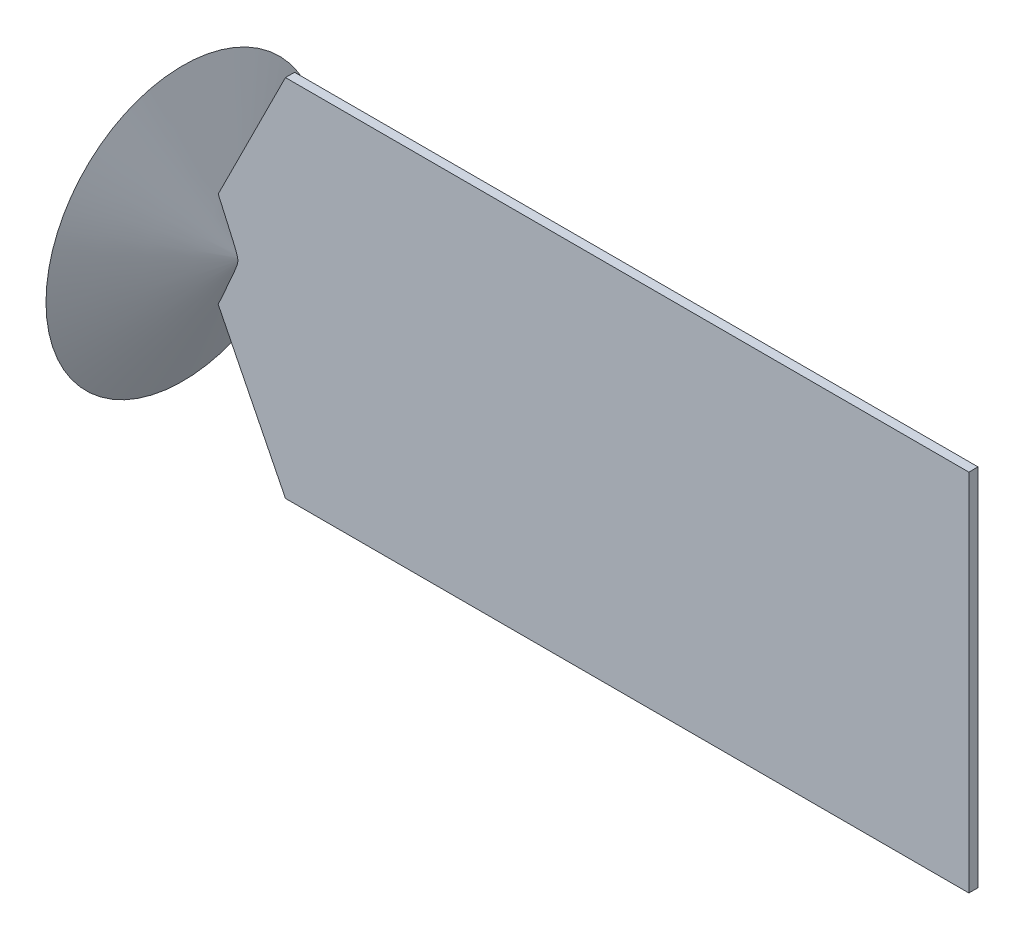
ISO-10303-21;
HEADER;
FILE_DESCRIPTION(('STEP AP214'),'2;1');
FILE_NAME('part.step','',(''),(''),'','','');
FILE_SCHEMA(('AUTOMOTIVE_DESIGN { 1 0 10303 214 1 1 1 1 }'));
ENDSEC;
DATA;
#1=APPLICATION_CONTEXT('core data for automotive mechanical design processes');
#2=APPLICATION_PROTOCOL_DEFINITION('international standard','automotive_design',2000,#1);
#3=PRODUCT_CONTEXT('',#1,'mechanical');
#4=PRODUCT('Part','Part','',(#3));
#5=PRODUCT_RELATED_PRODUCT_CATEGORY('part','',(#4));
#6=PRODUCT_DEFINITION_FORMATION('','',#4);
#7=PRODUCT_DEFINITION_CONTEXT('part definition',#1,'design');
#8=PRODUCT_DEFINITION('design','',#6,#7);
#9=PRODUCT_DEFINITION_SHAPE('','',#8);
#10=(LENGTH_UNIT() NAMED_UNIT(*) SI_UNIT(.MILLI.,.METRE.));
#11=(NAMED_UNIT(*) PLANE_ANGLE_UNIT() SI_UNIT($,.RADIAN.));
#12=(NAMED_UNIT(*) SI_UNIT($,.STERADIAN.) SOLID_ANGLE_UNIT());
#13=UNCERTAINTY_MEASURE_WITH_UNIT(LENGTH_MEASURE(1.E-05),#10,'distance_accuracy_value','');
#14=(GEOMETRIC_REPRESENTATION_CONTEXT(3) GLOBAL_UNCERTAINTY_ASSIGNED_CONTEXT((#13)) GLOBAL_UNIT_ASSIGNED_CONTEXT((#10,
#11,#12)) REPRESENTATION_CONTEXT('',''));
#15=CARTESIAN_POINT('',(0.,0.,0.));
#16=DIRECTION('',(0.,0.,1.));
#17=DIRECTION('',(1.,0.,0.));
#18=AXIS2_PLACEMENT_3D('',#15,#16,#17);
#19=CARTESIAN_POINT('',(-95.,0.,1.));
#20=DIRECTION('',(0.894427190999916,0.447213595499958,0.));
#21=DIRECTION('',(-0.447213595499958,0.894427190999916,0.));
#22=AXIS2_PLACEMENT_3D('',#19,#20,#21);
#23=PLANE('',#22);
#24=CARTESIAN_POINT('',(-89.7582757894268,-10.4834484211464,-1.0002));
#25=CARTESIAN_POINT('',(-89.7507430933371,-10.4985138133259,-0.6668));
#26=CARTESIAN_POINT('',(-89.7469767452922,-10.5060465094157,-0.3334));
#27=CARTESIAN_POINT('',(-89.7469767452922,-10.5060465094157,0.3334));
#28=CARTESIAN_POINT('',(-89.7507430933371,-10.4985138133259,0.6668));
#29=CARTESIAN_POINT('',(-89.7582757894268,-10.4834484211465,1.0002));
#30=B_SPLINE_CURVE_WITH_KNOTS('',3,(#24,#25,#26,#27,#28,#29),.UNSPECIFIED.,.F.,.F.,(4,2,4),(0.,
1.00051905628618,2.00103811257235),.UNSPECIFIED.);
#31=CARTESIAN_POINT('',(-89.7582712716824,-10.4834574566353,-1.));
#32=VERTEX_POINT('',#31);
#33=CARTESIAN_POINT('',(-89.7582712716824,-10.4834574566353,1.));
#34=VERTEX_POINT('',#33);
#35=EDGE_CURVE('E104',#32,#34,#30,.T.);
#36=ORIENTED_EDGE('',*,*,#35,.F.);
#37=DIRECTION('',(0.447213595499958,-0.894427190999916,0.));
#38=VECTOR('',#37,1.);
#39=CARTESIAN_POINT('',(-95.,0.,-1.));
#40=LINE('',#39,#38);
#41=CARTESIAN_POINT('',(-75.,-40.,-1.));
#42=VERTEX_POINT('',#41);
#43=EDGE_CURVE('E93',#32,#42,#40,.T.);
#44=ORIENTED_EDGE('',*,*,#43,.T.);
#45=DIRECTION('',(0.,0.,-1.));
#46=VECTOR('',#45,1.);
#47=CARTESIAN_POINT('',(-75.,-40.,1.));
#48=LINE('',#47,#46);
#49=CARTESIAN_POINT('',(-75.,-40.,1.));
#50=VERTEX_POINT('',#49);
#51=EDGE_CURVE('E48',#50,#42,#48,.T.);
#52=ORIENTED_EDGE('',*,*,#51,.F.);
#53=DIRECTION('',(0.447213595499958,-0.894427190999916,0.));
#54=VECTOR('',#53,1.);
#55=CARTESIAN_POINT('',(-95.,0.,1.));
#56=LINE('',#55,#54);
#57=EDGE_CURVE('E105',#34,#50,#56,.T.);
#58=ORIENTED_EDGE('',*,*,#57,.F.);
#59=EDGE_LOOP('',(#36,#44,#52,#58));
#60=FACE_BOUND('',#59,.T.);
#61=ADVANCED_FACE('F34',(#60),#23,.F.);
#62=CARTESIAN_POINT('',(-95.,0.,1.));
#63=DIRECTION('',(-0.894427190999916,0.447213595499958,0.));
#64=DIRECTION('',(-0.447213595499958,-0.894427190999916,0.));
#65=AXIS2_PLACEMENT_3D('',#62,#63,#64);
#66=PLANE('',#65);
#67=DIRECTION('',(0.447213595499958,0.894427190999916,0.));
#68=VECTOR('',#67,1.);
#69=CARTESIAN_POINT('',(-95.,0.,-1.));
#70=LINE('',#69,#68);
#71=CARTESIAN_POINT('',(-89.7582712716824,10.4834574566353,-1.));
#72=VERTEX_POINT('',#71);
#73=CARTESIAN_POINT('',(-75.,40.,-1.));
#74=VERTEX_POINT('',#73);
#75=EDGE_CURVE('E145',#72,#74,#70,.T.);
#76=ORIENTED_EDGE('',*,*,#75,.F.);
#77=CARTESIAN_POINT('',(-89.7582757894268,10.4834484211464,-1.0002));
#78=CARTESIAN_POINT('',(-89.7507430933371,10.4985138133259,-0.6668));
#79=CARTESIAN_POINT('',(-89.7469767452922,10.5060465094157,-0.3334));
#80=CARTESIAN_POINT('',(-89.7469767452922,10.5060465094157,0.3334));
#81=CARTESIAN_POINT('',(-89.7507430933371,10.4985138133259,0.6668));
#82=CARTESIAN_POINT('',(-89.7582757894268,10.4834484211465,1.0002));
#83=B_SPLINE_CURVE_WITH_KNOTS('',3,(#77,#78,#79,#80,#81,#82),.UNSPECIFIED.,.F.,.F.,(4,2,4),(0.,
1.00051905628618,2.00103811257235),.UNSPECIFIED.);
#84=CARTESIAN_POINT('',(-89.7582712716824,10.4834574566353,1.));
#85=VERTEX_POINT('',#84);
#86=EDGE_CURVE('E55',#72,#85,#83,.T.);
#87=ORIENTED_EDGE('',*,*,#86,.T.);
#88=DIRECTION('',(0.447213595499958,0.894427190999916,0.));
#89=VECTOR('',#88,1.);
#90=CARTESIAN_POINT('',(-95.,0.,1.));
#91=LINE('',#90,#89);
#92=CARTESIAN_POINT('',(-75.,40.,1.));
#93=VERTEX_POINT('',#92);
#94=EDGE_CURVE('E153',#85,#93,#91,.T.);
#95=ORIENTED_EDGE('',*,*,#94,.T.);
#96=DIRECTION('',(0.,0.,-1.));
#97=VECTOR('',#96,1.);
#98=CARTESIAN_POINT('',(-75.,40.,1.));
#99=LINE('',#98,#97);
#100=EDGE_CURVE('E154',#93,#74,#99,.T.);
#101=ORIENTED_EDGE('',*,*,#100,.T.);
#102=EDGE_LOOP('',(#76,#87,#95,#101));
#103=FACE_BOUND('',#102,.T.);
#104=ADVANCED_FACE('F124',(#103),#66,.T.);
#105=CARTESIAN_POINT('',(0.,0.,1.));
#106=DIRECTION('',(0.,0.,1.));
#107=DIRECTION('',(1.,0.,0.));
#108=AXIS2_PLACEMENT_3D('',#105,#106,#107);
#109=PLANE('',#108);
#110=ORIENTED_EDGE('',*,*,#94,.F.);
#111=CARTESIAN_POINT('',(-126.041480740853,90.8278253029822,1.));
#112=CARTESIAN_POINT('',(-123.747154558435,85.7496757802992,1.));
#113=CARTESIAN_POINT('',(-121.452834006979,80.6715237111113,1.));
#114=CARTESIAN_POINT('',(-116.864256634821,70.5151739922731,1.));
#115=CARTESIAN_POINT('',(-114.56999981431,65.436976342536,1.));
#116=CARTESIAN_POINT('',(-109.984582638064,55.287091829711,1.));
#117=CARTESIAN_POINT('',(-107.693422115829,50.2154050418398,1.));
#118=CARTESIAN_POINT('',(-103.111366843538,40.0719281059663,1.));
#119=CARTESIAN_POINT('',(-100.820472092772,35.0001379582847,1.));
#120=CARTESIAN_POINT('',(-97.774725275913,28.2554825471736,1.));
#121=CARTESIAN_POINT('',(-97.0194443915337,26.5828109452095,1.));
#122=CARTESIAN_POINT('',(-95.509078687733,23.2373664515675,1.));
#123=CARTESIAN_POINT('',(-94.7539938695864,21.5645935593141,1.));
#124=CARTESIAN_POINT('',(-93.2437280791745,18.2178654462482,1.));
#125=CARTESIAN_POINT('',(-92.4885473281628,16.5439101255531,1.));
#126=CARTESIAN_POINT('',(-91.3564606787007,14.0326891147298,1.));
#127=CARTESIAN_POINT('',(-90.9792163871622,13.1955759818217,1.));
#128=CARTESIAN_POINT('',(-90.2251229969341,11.5211718609503,1.));
#129=CARTESIAN_POINT('',(-89.8482738981583,10.6838808730259,1.));
#130=CARTESIAN_POINT('',(-89.2229103281931,9.29269088349383,1.));
#131=CARTESIAN_POINT('',(-88.9741745986825,8.73889134522481,1.));
#132=CARTESIAN_POINT('',(-88.4772770311668,7.63099740064958,1.));
#133=CARTESIAN_POINT('',(-88.2291152260095,7.07690297959472,1.));
#134=CARTESIAN_POINT('',(-87.8578876215582,6.24568547762089,1.));
#135=CARTESIAN_POINT('',(-87.7343842326288,5.96875787281964,1.));
#136=CARTESIAN_POINT('',(-87.4878186492343,5.41470472188489,1.));
#137=CARTESIAN_POINT('',(-87.3647564566255,5.13757917492443,1.));
#138=CARTESIAN_POINT('',(-87.1193495079313,4.58306448305026,1.));
#139=CARTESIAN_POINT('',(-86.9970046384543,4.30567538831915,1.));
#140=CARTESIAN_POINT('',(-86.753483411062,3.75038591422445,1.));
#141=CARTESIAN_POINT('',(-86.6323070411054,3.47248554016478,1.));
#142=CARTESIAN_POINT('',(-86.4311939221459,3.00605020830253,1.));
#143=CARTESIAN_POINT('',(-86.3506364370015,2.81778308981185,1.));
#144=CARTESIAN_POINT('',(-86.191248594651,2.44042254292266,1.));
#145=CARTESIAN_POINT('',(-86.1124189512296,2.25132881034157,1.));
#146=CARTESIAN_POINT('',(-85.9965176164937,1.9661936395521,1.));
#147=CARTESIAN_POINT('',(-85.9581844169323,1.8706663823217,1.));
#148=CARTESIAN_POINT('',(-85.8827762078265,1.67911792668056,1.));
#149=CARTESIAN_POINT('',(-85.8457011509277,1.58309674701725,1.));
#150=CARTESIAN_POINT('',(-85.7734500064163,1.39038646099011,1.));
#151=CARTESIAN_POINT('',(-85.7382730895466,1.2936976674618,1.));
#152=CARTESIAN_POINT('',(-85.6708704049709,1.09930493143096,1.));
#153=CARTESIAN_POINT('',(-85.6386438794325,1.00160125682895,1.));
#154=CARTESIAN_POINT('',(-85.5852816176464,0.825377147981615,1.));
#155=CARTESIAN_POINT('',(-85.5632379193187,0.747136195300864,1.));
#156=CARTESIAN_POINT('',(-85.5236596593087,0.589492453232383,1.));
#157=CARTESIAN_POINT('',(-85.5061247991363,0.510089741122402,1.));
#158=CARTESIAN_POINT('',(-85.4777613577283,0.351131718552168,1.));
#159=CARTESIAN_POINT('',(-85.4668464760974,0.271592559011278,1.));
#160=CARTESIAN_POINT('',(-85.4532756642835,0.111830217472739,1.));
#161=CARTESIAN_POINT('',(-85.4506130680967,0.0316076400833211,1.));
#162=CARTESIAN_POINT('',(-85.4541238027427,-0.129019736508021,1.));
#163=CARTESIAN_POINT('',(-85.4603400532212,-0.209423532263964,1.));
#164=CARTESIAN_POINT('',(-85.4803963287076,-0.369292577369954,1.));
#165=CARTESIAN_POINT('',(-85.4942436753199,-0.448756850393382,1.));
#166=CARTESIAN_POINT('',(-85.5277323177325,-0.607626638698294,1.));
#167=CARTESIAN_POINT('',(-85.5474555683923,-0.687014218214137,1.));
#168=CARTESIAN_POINT('',(-85.5799463392852,-0.805263927835261,1.));
#169=CARTESIAN_POINT('',(-85.5912601201955,-0.844539477373201,1.));
#170=CARTESIAN_POINT('',(-85.6146905127715,-0.922849846704458,1.));
#171=CARTESIAN_POINT('',(-85.6268071003394,-0.961884673685099,1.));
#172=CARTESIAN_POINT('',(-85.6677278977462,-1.08992914135677,1.));
#173=CARTESIAN_POINT('',(-85.697909902623,-1.17849709398215,1.));
#174=CARTESIAN_POINT('',(-85.7604608567929,-1.35486103077918,1.));
#175=CARTESIAN_POINT('',(-85.7928301732109,-1.4426568825504,1.));
#176=CARTESIAN_POINT('',(-85.8590488064331,-1.61773236532251,1.));
#177=CARTESIAN_POINT('',(-85.8928987923547,-1.7050117422728,1.));
#178=CARTESIAN_POINT('',(-85.9616178767738,-1.87916928078157,1.));
#179=CARTESIAN_POINT('',(-85.9964870042348,-1.96604743085592,1.));
#180=CARTESIAN_POINT('',(-86.1022527885532,-2.22645306452585,1.));
#181=CARTESIAN_POINT('',(-86.174226706062,-2.39954208479165,1.));
#182=CARTESIAN_POINT('',(-86.3197252411509,-2.74500470383034,1.));
#183=CARTESIAN_POINT('',(-86.3932494181643,-2.91737848963401,1.));
#184=CARTESIAN_POINT('',(-86.5408551439453,-3.26074610565677,1.));
#185=CARTESIAN_POINT('',(-86.6149312806818,-3.43174226393746,1.));
#186=CARTESIAN_POINT('',(-86.7637135732202,-3.77347479360594,1.));
#187=CARTESIAN_POINT('',(-86.8384197752438,-3.94421114483034,1.));
#188=CARTESIAN_POINT('',(-86.9882042133759,-4.28536359918631,1.));
#189=CARTESIAN_POINT('',(-87.0632821185259,-4.45577984770271,1.));
#190=CARTESIAN_POINT('',(-87.2137439315393,-4.7964723023141,1.));
#191=CARTESIAN_POINT('',(-87.2891278321219,-4.9667485116266,1.));
#192=CARTESIAN_POINT('',(-87.5152894329147,-5.47669411843674,1.));
#193=CARTESIAN_POINT('',(-87.6664007161971,-5.81621553311521,1.));
#194=CARTESIAN_POINT('',(-87.969145805074,-6.49502538994909,1.));
#195=CARTESIAN_POINT('',(-88.1207796110919,-6.83431383191539,1.));
#196=CARTESIAN_POINT('',(-88.57617620516,-7.85196616820009,1.));
#197=CARTESIAN_POINT('',(-88.8804309567504,-8.5301098567511,1.));
#198=CARTESIAN_POINT('',(-89.4896409626023,-9.88631920209654,1.));
#199=CARTESIAN_POINT('',(-89.7945963948352,-10.5643847788574,1.));
#200=CARTESIAN_POINT('',(-90.404858276207,-11.9203550685687,1.));
#201=CARTESIAN_POINT('',(-90.7101647240943,-12.5982597820824,1.));
#202=CARTESIAN_POINT('',(-91.3216343873381,-13.9554005882893,1.));
#203=CARTESIAN_POINT('',(-91.6277980529077,-14.6346364780826,1.));
#204=CARTESIAN_POINT('',(-92.2402674729714,-15.9930449820826,1.));
#205=CARTESIAN_POINT('',(-92.5465732276023,-16.6722175962276,1.));
#206=CARTESIAN_POINT('',(-93.4655774526722,-18.7095419898815,1.));
#207=CARTESIAN_POINT('',(-94.0784206513726,-20.0676284806109,1.));
#208=CARTESIAN_POINT('',(-96.0006832001852,-24.3266371943236,1.));
#209=CARTESIAN_POINT('',(-97.310446073762,-27.2274043525484,1.));
#210=CARTESIAN_POINT('',(-99.9302785515128,-33.0288005579184,1.));
#211=CARTESIAN_POINT('',(-101.240348155724,-35.9294296050466,1.));
#212=CARTESIAN_POINT('',(-103.860699886618,-41.7307388207842,1.));
#213=CARTESIAN_POINT('',(-105.170982019927,-44.6314189864001,1.));
#214=CARTESIAN_POINT('',(-107.791631293267,-50.4327407919184,1.));
#215=CARTESIAN_POINT('',(-109.101998433294,-53.3333824318221,1.));
#216=CARTESIAN_POINT('',(-113.017161765804,-61.999829015366,1.));
#217=CARTESIAN_POINT('',(-115.622031198798,-67.7656008717281,1.));
#218=CARTESIAN_POINT('',(-120.831760151626,-79.2968571539487,1.));
#219=CARTESIAN_POINT('',(-123.436619667273,-85.0623415816993,1.));
#220=CARTESIAN_POINT('',(-126.041480740853,-90.8278253029822,1.));
#221=B_SPLINE_CURVE_WITH_KNOTS('',3,(#111,#112,#113,#114,#115,#116,#117,#118,#119,#120,#121,
#122,#123,#124,#125,#126,#127,#128,#129,#130,#131,#132,#133,#134,#135,#136,#137,#138,#139,#140,
#141,#142,#143,#144,#145,#146,#147,#148,#149,#150,#151,#152,#153,#154,#155,#156,#157,#158,#159,
#160,#161,#162,#163,#164,#165,#166,#167,#168,#169,#170,#171,#172,#173,#174,#175,#176,#177,#178,
#179,#180,#181,#182,#183,#184,#185,#186,#187,#188,#189,#190,#191,#192,#193,#194,#195,#196,#197,
#198,#199,#200,#201,#202,#203,#204,#205,#206,#207,#208,#209,#210,#211,#212,#213,#214,#215,#216,
#217,#218,#219,#220),.UNSPECIFIED.,.F.,.F.,(4,2,2,2,2,2,2,2,2,2,2,2,2,2,2,2,2,2,2,2,2,2,2,2,2,2,
2,2,2,2,2,2,2,2,2,2,2,2,2,2,2,2,2,2,2,2,2,2,2,2,2,2,2,2,4),(0.,16.7171713214745,
33.4343885386138,50.1299810962456,66.8255279637584,72.3313898745486,77.8372867251493,
83.3465350931401,86.1011030693427,88.8556704446691,90.676953009842,92.4983373538226,
93.407995266414,94.3176570018808,95.2271708399247,96.1366752954683,96.7510061981045,
97.3655862764405,97.6743751780742,97.9831524444772,98.2917937019412,98.6003554586045,
98.844130120885,99.0878886408592,99.328397021786,99.5687110749508,99.810190726354,
100.051902468184,100.297157326202,100.419769545395,100.542378085819,100.823033967842,
101.103737073557,101.384568367233,101.665407649815,102.227760516881,102.789955667846,
103.349008623927,103.908102955416,104.466766555837,105.025416940379,106.140308263457,
107.255200490358,109.485008640858,111.71546519573,113.945913822137,116.181059944568,
118.416208225993,122.886083056486,132.434347755097,141.982613626967,151.531281708858,
161.079949452598,180.060603516335,199.040459520413),.UNSPECIFIED.);
#222=EDGE_CURVE('E62',#85,#34,#221,.T.);
#223=ORIENTED_EDGE('',*,*,#222,.T.);
#224=ORIENTED_EDGE('',*,*,#57,.T.);
#225=DIRECTION('',(1.,0.,0.));
#226=VECTOR('',#225,1.);
#227=CARTESIAN_POINT('',(-75.,-40.,1.));
#228=LINE('',#227,#226);
#229=CARTESIAN_POINT('',(75.,-40.,1.));
#230=VERTEX_POINT('',#229);
#231=EDGE_CURVE('E144',#50,#230,#228,.T.);
#232=ORIENTED_EDGE('',*,*,#231,.T.);
#233=DIRECTION('',(0.,-1.,0.));
#234=VECTOR('',#233,1.);
#235=CARTESIAN_POINT('',(75.,40.,1.));
#236=LINE('',#235,#234);
#237=CARTESIAN_POINT('',(75.,40.,1.));
#238=VERTEX_POINT('',#237);
#239=EDGE_CURVE('E147',#238,#230,#236,.T.);
#240=ORIENTED_EDGE('',*,*,#239,.F.);
#241=DIRECTION('',(1.,0.,0.));
#242=VECTOR('',#241,1.);
#243=CARTESIAN_POINT('',(-75.,40.,1.));
#244=LINE('',#243,#242);
#245=EDGE_CURVE('E150',#93,#238,#244,.T.);
#246=ORIENTED_EDGE('',*,*,#245,.F.);
#247=EDGE_LOOP('',(#110,#223,#224,#232,#240,#246));
#248=FACE_BOUND('',#247,.T.);
#249=ADVANCED_FACE('F133',(#248),#109,.T.);
#250=CARTESIAN_POINT('',(0.,0.,-1.));
#251=DIRECTION('',(0.,0.,1.));
#252=DIRECTION('',(1.,0.,0.));
#253=AXIS2_PLACEMENT_3D('',#250,#251,#252);
#254=PLANE('',#253);
#255=CARTESIAN_POINT('',(-126.041480740853,90.8278253029822,-1.));
#256=CARTESIAN_POINT('',(-123.747154558435,85.7496757802992,-1.));
#257=CARTESIAN_POINT('',(-121.452834006979,80.6715237111113,-1.));
#258=CARTESIAN_POINT('',(-116.864256634821,70.5151739922731,-1.));
#259=CARTESIAN_POINT('',(-114.56999981431,65.436976342536,-1.));
#260=CARTESIAN_POINT('',(-109.984582638064,55.287091829711,-1.));
#261=CARTESIAN_POINT('',(-107.693422115829,50.2154050418398,-1.));
#262=CARTESIAN_POINT('',(-103.111366843538,40.0719281059663,-1.));
#263=CARTESIAN_POINT('',(-100.820472092772,35.0001379582847,-1.));
#264=CARTESIAN_POINT('',(-97.774725275913,28.2554825471736,-1.));
#265=CARTESIAN_POINT('',(-97.0194443915337,26.5828109452095,-1.));
#266=CARTESIAN_POINT('',(-95.509078687733,23.2373664515675,-1.));
#267=CARTESIAN_POINT('',(-94.7539938695864,21.5645935593141,-1.));
#268=CARTESIAN_POINT('',(-93.2437280791745,18.2178654462482,-1.));
#269=CARTESIAN_POINT('',(-92.4885473281628,16.5439101255531,-1.));
#270=CARTESIAN_POINT('',(-91.3564606787007,14.0326891147298,-1.));
#271=CARTESIAN_POINT('',(-90.9792163871622,13.1955759818217,-1.));
#272=CARTESIAN_POINT('',(-90.2251229969341,11.5211718609503,-1.));
#273=CARTESIAN_POINT('',(-89.8482738981583,10.6838808730259,-1.));
#274=CARTESIAN_POINT('',(-89.2229103281931,9.29269088349383,-1.));
#275=CARTESIAN_POINT('',(-88.9741745986825,8.73889134522481,-1.));
#276=CARTESIAN_POINT('',(-88.4772770311668,7.63099740064958,-1.));
#277=CARTESIAN_POINT('',(-88.2291152260095,7.07690297959472,-1.));
#278=CARTESIAN_POINT('',(-87.8578876215582,6.24568547762089,-1.));
#279=CARTESIAN_POINT('',(-87.7343842326288,5.96875787281964,-1.));
#280=CARTESIAN_POINT('',(-87.4878186492343,5.41470472188489,-1.));
#281=CARTESIAN_POINT('',(-87.3647564566255,5.13757917492443,-1.));
#282=CARTESIAN_POINT('',(-87.1193495079313,4.58306448305026,-1.));
#283=CARTESIAN_POINT('',(-86.9970046384543,4.30567538831915,-1.));
#284=CARTESIAN_POINT('',(-86.753483411062,3.75038591422445,-1.));
#285=CARTESIAN_POINT('',(-86.6323070411054,3.47248554016478,-1.));
#286=CARTESIAN_POINT('',(-86.4311939221459,3.00605020830253,-1.));
#287=CARTESIAN_POINT('',(-86.3506364370015,2.81778308981185,-1.));
#288=CARTESIAN_POINT('',(-86.191248594651,2.44042254292266,-1.));
#289=CARTESIAN_POINT('',(-86.1124189512296,2.25132881034157,-1.));
#290=CARTESIAN_POINT('',(-85.9965176164937,1.9661936395521,-1.));
#291=CARTESIAN_POINT('',(-85.9581844169323,1.8706663823217,-1.));
#292=CARTESIAN_POINT('',(-85.8827762078265,1.67911792668056,-1.));
#293=CARTESIAN_POINT('',(-85.8457011509277,1.58309674701725,-1.));
#294=CARTESIAN_POINT('',(-85.7734500064163,1.39038646099011,-1.));
#295=CARTESIAN_POINT('',(-85.7382730895466,1.2936976674618,-1.));
#296=CARTESIAN_POINT('',(-85.6708704049709,1.09930493143096,-1.));
#297=CARTESIAN_POINT('',(-85.6386438794325,1.00160125682895,-1.));
#298=CARTESIAN_POINT('',(-85.5852816176464,0.825377147981615,-1.));
#299=CARTESIAN_POINT('',(-85.5632379193187,0.747136195300864,-1.));
#300=CARTESIAN_POINT('',(-85.5236596593087,0.589492453232383,-1.));
#301=CARTESIAN_POINT('',(-85.5061247991363,0.510089741122402,-1.));
#302=CARTESIAN_POINT('',(-85.4777613577283,0.351131718552168,-1.));
#303=CARTESIAN_POINT('',(-85.4668464760974,0.271592559011278,-1.));
#304=CARTESIAN_POINT('',(-85.4532756642835,0.111830217472739,-1.));
#305=CARTESIAN_POINT('',(-85.4506130680967,0.0316076400833211,-1.));
#306=CARTESIAN_POINT('',(-85.4541238027427,-0.129019736508021,-1.));
#307=CARTESIAN_POINT('',(-85.4603400532212,-0.209423532263964,-1.));
#308=CARTESIAN_POINT('',(-85.4803963287076,-0.369292577369954,-1.));
#309=CARTESIAN_POINT('',(-85.4942436753199,-0.448756850393382,-1.));
#310=CARTESIAN_POINT('',(-85.5277323177325,-0.607626638698294,-1.));
#311=CARTESIAN_POINT('',(-85.5474555683923,-0.687014218214137,-1.));
#312=CARTESIAN_POINT('',(-85.5799463392852,-0.805263927835261,-1.));
#313=CARTESIAN_POINT('',(-85.5912601201955,-0.844539477373201,-1.));
#314=CARTESIAN_POINT('',(-85.6146905127715,-0.922849846704458,-1.));
#315=CARTESIAN_POINT('',(-85.6268071003394,-0.961884673685099,-1.));
#316=CARTESIAN_POINT('',(-85.6677278977462,-1.08992914135677,-1.));
#317=CARTESIAN_POINT('',(-85.697909902623,-1.17849709398215,-1.));
#318=CARTESIAN_POINT('',(-85.7604608567929,-1.35486103077918,-1.));
#319=CARTESIAN_POINT('',(-85.7928301732109,-1.4426568825504,-1.));
#320=CARTESIAN_POINT('',(-85.8590488064331,-1.61773236532251,-1.));
#321=CARTESIAN_POINT('',(-85.8928987923547,-1.7050117422728,-1.));
#322=CARTESIAN_POINT('',(-85.9616178767738,-1.87916928078157,-1.));
#323=CARTESIAN_POINT('',(-85.9964870042348,-1.96604743085592,-1.));
#324=CARTESIAN_POINT('',(-86.1022527885532,-2.22645306452585,-1.));
#325=CARTESIAN_POINT('',(-86.174226706062,-2.39954208479165,-1.));
#326=CARTESIAN_POINT('',(-86.3197252411509,-2.74500470383034,-1.));
#327=CARTESIAN_POINT('',(-86.3932494181643,-2.91737848963401,-1.));
#328=CARTESIAN_POINT('',(-86.5408551439453,-3.26074610565677,-1.));
#329=CARTESIAN_POINT('',(-86.6149312806818,-3.43174226393746,-1.));
#330=CARTESIAN_POINT('',(-86.7637135732202,-3.77347479360594,-1.));
#331=CARTESIAN_POINT('',(-86.8384197752438,-3.94421114483034,-1.));
#332=CARTESIAN_POINT('',(-86.9882042133759,-4.28536359918631,-1.));
#333=CARTESIAN_POINT('',(-87.0632821185259,-4.45577984770271,-1.));
#334=CARTESIAN_POINT('',(-87.2137439315393,-4.7964723023141,-1.));
#335=CARTESIAN_POINT('',(-87.2891278321219,-4.9667485116266,-1.));
#336=CARTESIAN_POINT('',(-87.5152894329147,-5.47669411843674,-1.));
#337=CARTESIAN_POINT('',(-87.6664007161971,-5.81621553311521,-1.));
#338=CARTESIAN_POINT('',(-87.969145805074,-6.49502538994909,-1.));
#339=CARTESIAN_POINT('',(-88.1207796110919,-6.83431383191539,-1.));
#340=CARTESIAN_POINT('',(-88.57617620516,-7.85196616820009,-1.));
#341=CARTESIAN_POINT('',(-88.8804309567504,-8.5301098567511,-1.));
#342=CARTESIAN_POINT('',(-89.4896409626023,-9.88631920209654,-1.));
#343=CARTESIAN_POINT('',(-89.7945963948352,-10.5643847788574,-1.));
#344=CARTESIAN_POINT('',(-90.404858276207,-11.9203550685687,-1.));
#345=CARTESIAN_POINT('',(-90.7101647240943,-12.5982597820824,-1.));
#346=CARTESIAN_POINT('',(-91.3216343873381,-13.9554005882893,-1.));
#347=CARTESIAN_POINT('',(-91.6277980529077,-14.6346364780826,-1.));
#348=CARTESIAN_POINT('',(-92.2402674729714,-15.9930449820826,-1.));
#349=CARTESIAN_POINT('',(-92.5465732276023,-16.6722175962276,-1.));
#350=CARTESIAN_POINT('',(-93.4655774526722,-18.7095419898815,-1.));
#351=CARTESIAN_POINT('',(-94.0784206513726,-20.0676284806109,-1.));
#352=CARTESIAN_POINT('',(-96.0006832001852,-24.3266371943236,-1.));
#353=CARTESIAN_POINT('',(-97.310446073762,-27.2274043525484,-1.));
#354=CARTESIAN_POINT('',(-99.9302785515128,-33.0288005579184,-1.));
#355=CARTESIAN_POINT('',(-101.240348155724,-35.9294296050466,-1.));
#356=CARTESIAN_POINT('',(-103.860699886618,-41.7307388207842,-1.));
#357=CARTESIAN_POINT('',(-105.170982019927,-44.6314189864001,-1.));
#358=CARTESIAN_POINT('',(-107.791631293267,-50.4327407919184,-1.));
#359=CARTESIAN_POINT('',(-109.101998433294,-53.3333824318221,-1.));
#360=CARTESIAN_POINT('',(-113.017161765804,-61.999829015366,-1.));
#361=CARTESIAN_POINT('',(-115.622031198798,-67.7656008717281,-1.));
#362=CARTESIAN_POINT('',(-120.831760151626,-79.2968571539487,-1.));
#363=CARTESIAN_POINT('',(-123.436619667273,-85.0623415816993,-1.));
#364=CARTESIAN_POINT('',(-126.041480740853,-90.8278253029822,-1.));
#365=B_SPLINE_CURVE_WITH_KNOTS('',3,(#255,#256,#257,#258,#259,#260,#261,#262,#263,#264,#265,
#266,#267,#268,#269,#270,#271,#272,#273,#274,#275,#276,#277,#278,#279,#280,#281,#282,#283,#284,
#285,#286,#287,#288,#289,#290,#291,#292,#293,#294,#295,#296,#297,#298,#299,#300,#301,#302,#303,
#304,#305,#306,#307,#308,#309,#310,#311,#312,#313,#314,#315,#316,#317,#318,#319,#320,#321,#322,
#323,#324,#325,#326,#327,#328,#329,#330,#331,#332,#333,#334,#335,#336,#337,#338,#339,#340,#341,
#342,#343,#344,#345,#346,#347,#348,#349,#350,#351,#352,#353,#354,#355,#356,#357,#358,#359,#360,
#361,#362,#363,#364),.UNSPECIFIED.,.F.,.F.,(4,2,2,2,2,2,2,2,2,2,2,2,2,2,2,2,2,2,2,2,2,2,2,2,2,2,
2,2,2,2,2,2,2,2,2,2,2,2,2,2,2,2,2,2,2,2,2,2,2,2,2,2,2,2,4),(0.,16.7171713214745,
33.4343885386138,50.1299810962456,66.8255279637584,72.3313898745486,77.8372867251493,
83.3465350931401,86.1011030693427,88.8556704446691,90.676953009842,92.4983373538226,
93.407995266414,94.3176570018808,95.2271708399247,96.1366752954683,96.7510061981045,
97.3655862764405,97.6743751780742,97.9831524444772,98.2917937019412,98.6003554586045,
98.844130120885,99.0878886408592,99.328397021786,99.5687110749508,99.810190726354,
100.051902468184,100.297157326202,100.419769545395,100.542378085819,100.823033967842,
101.103737073557,101.384568367233,101.665407649815,102.227760516881,102.789955667846,
103.349008623927,103.908102955416,104.466766555837,105.025416940379,106.140308263457,
107.255200490358,109.485008640858,111.71546519573,113.945913822137,116.181059944568,
118.416208225993,122.886083056486,132.434347755097,141.982613626967,151.531281708858,
161.079949452598,180.060603516335,199.040459520413),.UNSPECIFIED.);
#366=EDGE_CURVE('E11',#72,#32,#365,.T.);
#367=ORIENTED_EDGE('',*,*,#366,.F.);
#368=ORIENTED_EDGE('',*,*,#75,.T.);
#369=DIRECTION('',(1.,0.,0.));
#370=VECTOR('',#369,1.);
#371=CARTESIAN_POINT('',(-75.,40.,-1.));
#372=LINE('',#371,#370);
#373=CARTESIAN_POINT('',(75.,40.,-1.));
#374=VERTEX_POINT('',#373);
#375=EDGE_CURVE('E159',#74,#374,#372,.T.);
#376=ORIENTED_EDGE('',*,*,#375,.T.);
#377=DIRECTION('',(0.,-1.,0.));
#378=VECTOR('',#377,1.);
#379=CARTESIAN_POINT('',(75.,40.,-1.));
#380=LINE('',#379,#378);
#381=CARTESIAN_POINT('',(75.,-40.,-1.));
#382=VERTEX_POINT('',#381);
#383=EDGE_CURVE('E157',#374,#382,#380,.T.);
#384=ORIENTED_EDGE('',*,*,#383,.T.);
#385=DIRECTION('',(1.,0.,0.));
#386=VECTOR('',#385,1.);
#387=CARTESIAN_POINT('',(-75.,-40.,-1.));
#388=LINE('',#387,#386);
#389=EDGE_CURVE('E98',#42,#382,#388,.T.);
#390=ORIENTED_EDGE('',*,*,#389,.F.);
#391=ORIENTED_EDGE('',*,*,#43,.F.);
#392=EDGE_LOOP('',(#367,#368,#376,#384,#390,#391));
#393=FACE_BOUND('',#392,.T.);
#394=ADVANCED_FACE('F95',(#393),#254,.F.);
#395=CARTESIAN_POINT('',(-75.,-40.,1.));
#396=DIRECTION('',(0.,1.,0.));
#397=DIRECTION('',(0.,0.,1.));
#398=AXIS2_PLACEMENT_3D('',#395,#396,#397);
#399=PLANE('',#398);
#400=ORIENTED_EDGE('',*,*,#389,.T.);
#401=DIRECTION('',(0.,0.,-1.));
#402=VECTOR('',#401,1.);
#403=CARTESIAN_POINT('',(75.,-40.,1.));
#404=LINE('',#403,#402);
#405=EDGE_CURVE('E167',#230,#382,#404,.T.);
#406=ORIENTED_EDGE('',*,*,#405,.F.);
#407=ORIENTED_EDGE('',*,*,#231,.F.);
#408=ORIENTED_EDGE('',*,*,#51,.T.);
#409=EDGE_LOOP('',(#400,#406,#407,#408));
#410=FACE_BOUND('',#409,.T.);
#411=ADVANCED_FACE('F170',(#410),#399,.F.);
#412=CARTESIAN_POINT('',(75.,40.,1.));
#413=DIRECTION('',(1.,0.,0.));
#414=DIRECTION('',(0.,1.,0.));
#415=AXIS2_PLACEMENT_3D('',#412,#413,#414);
#416=PLANE('',#415);
#417=ORIENTED_EDGE('',*,*,#383,.F.);
#418=DIRECTION('',(0.,0.,-1.));
#419=VECTOR('',#418,1.);
#420=CARTESIAN_POINT('',(75.,40.,1.));
#421=LINE('',#420,#419);
#422=EDGE_CURVE('E165',#238,#374,#421,.T.);
#423=ORIENTED_EDGE('',*,*,#422,.F.);
#424=ORIENTED_EDGE('',*,*,#239,.T.);
#425=ORIENTED_EDGE('',*,*,#405,.T.);
#426=EDGE_LOOP('',(#417,#423,#424,#425));
#427=FACE_BOUND('',#426,.T.);
#428=ADVANCED_FACE('F179',(#427),#416,.T.);
#429=CARTESIAN_POINT('',(-75.,40.,1.));
#430=DIRECTION('',(0.,1.,0.));
#431=DIRECTION('',(0.,0.,1.));
#432=AXIS2_PLACEMENT_3D('',#429,#430,#431);
#433=PLANE('',#432);
#434=ORIENTED_EDGE('',*,*,#375,.F.);
#435=ORIENTED_EDGE('',*,*,#100,.F.);
#436=ORIENTED_EDGE('',*,*,#245,.T.);
#437=ORIENTED_EDGE('',*,*,#422,.T.);
#438=EDGE_LOOP('',(#434,#435,#436,#437));
#439=FACE_BOUND('',#438,.T.);
#440=ADVANCED_FACE('F132',(#439),#433,.T.);
#441=CARTESIAN_POINT('',(-85.,0.,0.));
#442=DIRECTION('',(-1.,0.,0.));
#443=DIRECTION('',(0.,0.,1.));
#444=AXIS2_PLACEMENT_3D('',#441,#442,#443);
#445=CONICAL_SURFACE('',#444,0.,1.14641926209272);
#446=ORIENTED_EDGE('',*,*,#222,.F.);
#447=ORIENTED_EDGE('',*,*,#86,.F.);
#448=ORIENTED_EDGE('',*,*,#366,.T.);
#449=ORIENTED_EDGE('',*,*,#35,.T.);
#450=EDGE_LOOP('',(#446,#447,#448,#449));
#451=FACE_BOUND('',#450,.T.);
#452=CARTESIAN_POINT('',(-98.5549849537728,0.,0.));
#453=DIRECTION('',(-1.,0.,0.));
#454=DIRECTION('',(0.,0.,1.));
#455=AXIS2_PLACEMENT_3D('',#452,#453,#454);
#456=CIRCLE('',#455,30.);
#457=CARTESIAN_POINT('',(-98.5549849537728,0.,30.));
#458=VERTEX_POINT('',#457);
#459=EDGE_CURVE('E110',#458,#458,#456,.T.);
#460=ORIENTED_EDGE('',*,*,#459,.F.);
#461=EDGE_LOOP('',(#460));
#462=FACE_BOUND('',#461,.T.);
#463=ADVANCED_FACE('F108',(#451,#462),#445,.T.);
#464=CARTESIAN_POINT('',(-98.5549849537728,-30.,2.09488880330588E-13));
#465=DIRECTION('',(1.,0.,0.));
#466=DIRECTION('',(0.,0.,-1.));
#467=AXIS2_PLACEMENT_3D('',#464,#465,#466);
#468=PLANE('',#467);
#469=ORIENTED_EDGE('',*,*,#459,.T.);
#470=EDGE_LOOP('',(#469));
#471=FACE_BOUND('',#470,.T.);
#472=ADVANCED_FACE('F131',(#471),#468,.F.);
#473=CLOSED_SHELL('',(#61,#104,#249,#394,#411,#428,#440,#463,#472));
#474=MANIFOLD_SOLID_BREP('B2',#473);
#475=ADVANCED_BREP_SHAPE_REPRESENTATION('',(#18,#474),#14);
#476=SHAPE_DEFINITION_REPRESENTATION(#9,#475);
ENDSEC;
END-ISO-10303-21;
